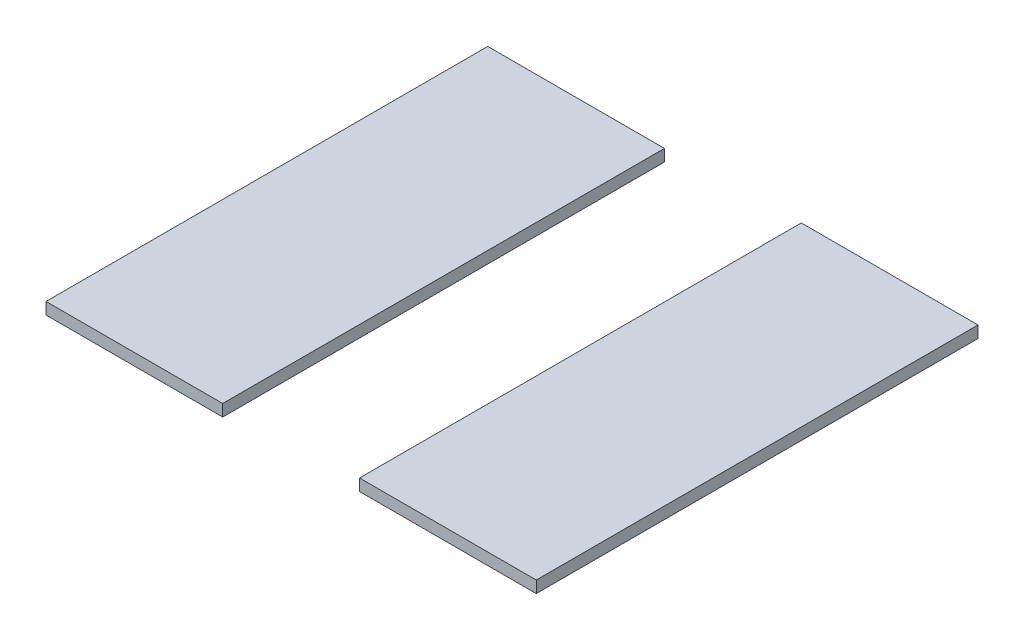
ISO-10303-21;
HEADER;
FILE_DESCRIPTION(('STEP AP214'),'2;1');
FILE_NAME('part.step','',(''),(''),'','','');
FILE_SCHEMA(('AUTOMOTIVE_DESIGN { 1 0 10303 214 1 1 1 1 }'));
ENDSEC;
DATA;
#1=APPLICATION_CONTEXT('core data for automotive mechanical design processes');
#2=APPLICATION_PROTOCOL_DEFINITION('international standard','automotive_design',2000,#1);
#3=PRODUCT_CONTEXT('',#1,'mechanical');
#4=PRODUCT('Part','Part','',(#3));
#5=PRODUCT_RELATED_PRODUCT_CATEGORY('part','',(#4));
#6=PRODUCT_DEFINITION_FORMATION('','',#4);
#7=PRODUCT_DEFINITION_CONTEXT('part definition',#1,'design');
#8=PRODUCT_DEFINITION('design','',#6,#7);
#9=PRODUCT_DEFINITION_SHAPE('','',#8);
#10=(LENGTH_UNIT() NAMED_UNIT(*) SI_UNIT(.MILLI.,.METRE.));
#11=(NAMED_UNIT(*) PLANE_ANGLE_UNIT() SI_UNIT($,.RADIAN.));
#12=(NAMED_UNIT(*) SI_UNIT($,.STERADIAN.) SOLID_ANGLE_UNIT());
#13=UNCERTAINTY_MEASURE_WITH_UNIT(LENGTH_MEASURE(1.E-05),#10,'distance_accuracy_value','');
#14=(GEOMETRIC_REPRESENTATION_CONTEXT(3) GLOBAL_UNCERTAINTY_ASSIGNED_CONTEXT((#13)) GLOBAL_UNIT_ASSIGNED_CONTEXT((#10,
#11,#12)) REPRESENTATION_CONTEXT('',''));
#15=CARTESIAN_POINT('',(0.,0.,0.));
#16=DIRECTION('',(0.,0.,1.));
#17=DIRECTION('',(1.,0.,0.));
#18=AXIS2_PLACEMENT_3D('',#15,#16,#17);
#19=CARTESIAN_POINT('',(-216.791531356344,0.,-95.4883179387457));
#20=DIRECTION('',(1.,0.,0.));
#21=DIRECTION('',(0.,0.,-1.));
#22=AXIS2_PLACEMENT_3D('',#19,#20,#21);
#23=PLANE('',#22);
#24=DIRECTION('',(0.,1.,0.));
#25=VECTOR('',#24,1.);
#26=CARTESIAN_POINT('',(-216.791531356344,0.,95.0116820612543));
#27=LINE('',#26,#25);
#28=CARTESIAN_POINT('',(-216.791531356344,0.,95.0116820612543));
#29=VERTEX_POINT('',#28);
#30=CARTESIAN_POINT('',(-216.791531356344,5.08,95.0116820612543));
#31=VERTEX_POINT('',#30);
#32=EDGE_CURVE('E12',#29,#31,#27,.T.);
#33=ORIENTED_EDGE('',*,*,#32,.F.);
#34=DIRECTION('',(0.,0.,-1.));
#35=VECTOR('',#34,1.);
#36=CARTESIAN_POINT('',(-216.791531356344,0.,-95.4883179387457));
#37=LINE('',#36,#35);
#38=CARTESIAN_POINT('',(-216.791531356344,0.,-95.4883179387457));
#39=VERTEX_POINT('',#38);
#40=EDGE_CURVE('E102',#29,#39,#37,.T.);
#41=ORIENTED_EDGE('',*,*,#40,.T.);
#42=DIRECTION('',(0.,1.,0.));
#43=VECTOR('',#42,1.);
#44=CARTESIAN_POINT('',(-216.791531356344,0.,-95.4883179387457));
#45=LINE('',#44,#43);
#46=CARTESIAN_POINT('',(-216.791531356344,5.08,-95.4883179387457));
#47=VERTEX_POINT('',#46);
#48=EDGE_CURVE('E57',#39,#47,#45,.T.);
#49=ORIENTED_EDGE('',*,*,#48,.T.);
#50=DIRECTION('',(0.,0.,1.));
#51=VECTOR('',#50,1.);
#52=CARTESIAN_POINT('',(-216.791531356344,5.08,0.));
#53=LINE('',#52,#51);
#54=EDGE_CURVE('E112',#31,#47,#53,.F.);
#55=ORIENTED_EDGE('',*,*,#54,.F.);
#56=EDGE_LOOP('',(#33,#41,#49,#55));
#57=FACE_BOUND('',#56,.T.);
#58=ADVANCED_FACE('F47',(#57),#23,.T.);
#59=CARTESIAN_POINT('',(-292.991531356344,0.,-95.4883179387457));
#60=DIRECTION('',(0.,0.,-1.));
#61=DIRECTION('',(-1.,0.,0.));
#62=AXIS2_PLACEMENT_3D('',#59,#60,#61);
#63=PLANE('',#62);
#64=ORIENTED_EDGE('',*,*,#48,.F.);
#65=DIRECTION('',(-1.,0.,0.));
#66=VECTOR('',#65,1.);
#67=CARTESIAN_POINT('',(-292.991531356344,0.,-95.4883179387457));
#68=LINE('',#67,#66);
#69=CARTESIAN_POINT('',(-292.991531356344,0.,-95.4883179387457));
#70=VERTEX_POINT('',#69);
#71=EDGE_CURVE('E97',#39,#70,#68,.T.);
#72=ORIENTED_EDGE('',*,*,#71,.T.);
#73=DIRECTION('',(0.,1.,0.));
#74=VECTOR('',#73,1.);
#75=CARTESIAN_POINT('',(-292.991531356344,0.,-95.4883179387457));
#76=LINE('',#75,#74);
#77=CARTESIAN_POINT('',(-292.991531356344,5.08,-95.4883179387457));
#78=VERTEX_POINT('',#77);
#79=EDGE_CURVE('E65',#70,#78,#76,.T.);
#80=ORIENTED_EDGE('',*,*,#79,.T.);
#81=DIRECTION('',(1.,0.,0.));
#82=VECTOR('',#81,1.);
#83=CARTESIAN_POINT('',(0.,5.08,-95.4883179387457));
#84=LINE('',#83,#82);
#85=EDGE_CURVE('E116',#47,#78,#84,.F.);
#86=ORIENTED_EDGE('',*,*,#85,.F.);
#87=EDGE_LOOP('',(#64,#72,#80,#86));
#88=FACE_BOUND('',#87,.T.);
#89=ADVANCED_FACE('F101',(#88),#63,.T.);
#90=CARTESIAN_POINT('',(-292.991531356344,0.,-95.4883179387457));
#91=DIRECTION('',(-1.,0.,0.));
#92=DIRECTION('',(0.,0.,1.));
#93=AXIS2_PLACEMENT_3D('',#90,#91,#92);
#94=PLANE('',#93);
#95=ORIENTED_EDGE('',*,*,#79,.F.);
#96=DIRECTION('',(0.,0.,1.));
#97=VECTOR('',#96,1.);
#98=CARTESIAN_POINT('',(-292.991531356344,0.,-95.4883179387457));
#99=LINE('',#98,#97);
#100=CARTESIAN_POINT('',(-292.991531356344,0.,95.0116820612543));
#101=VERTEX_POINT('',#100);
#102=EDGE_CURVE('E87',#70,#101,#99,.T.);
#103=ORIENTED_EDGE('',*,*,#102,.T.);
#104=DIRECTION('',(0.,1.,0.));
#105=VECTOR('',#104,1.);
#106=CARTESIAN_POINT('',(-292.991531356344,0.,95.0116820612543));
#107=LINE('',#106,#105);
#108=CARTESIAN_POINT('',(-292.991531356344,5.08,95.0116820612543));
#109=VERTEX_POINT('',#108);
#110=EDGE_CURVE('E51',#101,#109,#107,.T.);
#111=ORIENTED_EDGE('',*,*,#110,.T.);
#112=DIRECTION('',(0.,0.,1.));
#113=VECTOR('',#112,1.);
#114=CARTESIAN_POINT('',(-292.991531356344,5.08,0.));
#115=LINE('',#114,#113);
#116=EDGE_CURVE('E89',#78,#109,#115,.T.);
#117=ORIENTED_EDGE('',*,*,#116,.F.);
#118=EDGE_LOOP('',(#95,#103,#111,#117));
#119=FACE_BOUND('',#118,.T.);
#120=ADVANCED_FACE('F86',(#119),#94,.T.);
#121=CARTESIAN_POINT('',(-292.991531356344,0.,95.0116820612543));
#122=DIRECTION('',(0.,0.,1.));
#123=DIRECTION('',(1.,0.,0.));
#124=AXIS2_PLACEMENT_3D('',#121,#122,#123);
#125=PLANE('',#124);
#126=DIRECTION('',(1.,0.,0.));
#127=VECTOR('',#126,1.);
#128=CARTESIAN_POINT('',(-292.991531356344,0.,95.0116820612543));
#129=LINE('',#128,#127);
#130=EDGE_CURVE('E99',#101,#29,#129,.T.);
#131=ORIENTED_EDGE('',*,*,#130,.T.);
#132=ORIENTED_EDGE('',*,*,#32,.T.);
#133=DIRECTION('',(1.,0.,0.));
#134=VECTOR('',#133,1.);
#135=CARTESIAN_POINT('',(0.,5.08,95.0116820612543));
#136=LINE('',#135,#134);
#137=EDGE_CURVE('E104',#109,#31,#136,.T.);
#138=ORIENTED_EDGE('',*,*,#137,.F.);
#139=ORIENTED_EDGE('',*,*,#110,.F.);
#140=EDGE_LOOP('',(#131,#132,#138,#139));
#141=FACE_BOUND('',#140,.T.);
#142=ADVANCED_FACE('F49',(#141),#125,.T.);
#143=CARTESIAN_POINT('',(0.,5.08,0.));
#144=DIRECTION('',(0.,1.,0.));
#145=DIRECTION('',(0.,0.,1.));
#146=AXIS2_PLACEMENT_3D('',#143,#144,#145);
#147=PLANE('',#146);
#148=ORIENTED_EDGE('',*,*,#116,.T.);
#149=ORIENTED_EDGE('',*,*,#137,.T.);
#150=ORIENTED_EDGE('',*,*,#54,.T.);
#151=ORIENTED_EDGE('',*,*,#85,.T.);
#152=EDGE_LOOP('',(#148,#149,#150,#151));
#153=FACE_BOUND('',#152,.T.);
#154=ADVANCED_FACE('F115',(#153),#147,.T.);
#155=CARTESIAN_POINT('',(0.,0.,0.));
#156=DIRECTION('',(0.,1.,0.));
#157=DIRECTION('',(0.,0.,1.));
#158=AXIS2_PLACEMENT_3D('',#155,#156,#157);
#159=PLANE('',#158);
#160=ORIENTED_EDGE('',*,*,#102,.F.);
#161=ORIENTED_EDGE('',*,*,#71,.F.);
#162=ORIENTED_EDGE('',*,*,#40,.F.);
#163=ORIENTED_EDGE('',*,*,#130,.F.);
#164=EDGE_LOOP('',(#160,#161,#162,#163));
#165=FACE_BOUND('',#164,.T.);
#166=ADVANCED_FACE('F95',(#165),#159,.F.);
#167=CLOSED_SHELL('',(#58,#89,#120,#142,#154,#166));
#168=MANIFOLD_SOLID_BREP('B2',#167);
#169=CARTESIAN_POINT('',(-83.2532231404959,0.,-97.1707438016529));
#170=DIRECTION('',(1.,0.,0.));
#171=DIRECTION('',(0.,0.,-1.));
#172=AXIS2_PLACEMENT_3D('',#169,#170,#171);
#173=PLANE('',#172);
#174=DIRECTION('',(0.,1.,0.));
#175=VECTOR('',#174,1.);
#176=CARTESIAN_POINT('',(-83.2532231404959,0.,93.3292561983471));
#177=LINE('',#176,#175);
#178=CARTESIAN_POINT('',(-83.2532231404959,0.,93.3292561983471));
#179=VERTEX_POINT('',#178);
#180=CARTESIAN_POINT('',(-83.2532231404959,5.08,93.3292561983471));
#181=VERTEX_POINT('',#180);
#182=EDGE_CURVE('E45',#179,#181,#177,.T.);
#183=ORIENTED_EDGE('',*,*,#182,.F.);
#184=DIRECTION('',(0.,0.,-1.));
#185=VECTOR('',#184,1.);
#186=CARTESIAN_POINT('',(-83.2532231404959,0.,-97.1707438016529));
#187=LINE('',#186,#185);
#188=CARTESIAN_POINT('',(-83.2532231404959,0.,-97.1707438016529));
#189=VERTEX_POINT('',#188);
#190=EDGE_CURVE('E226',#179,#189,#187,.T.);
#191=ORIENTED_EDGE('',*,*,#190,.T.);
#192=DIRECTION('',(0.,1.,0.));
#193=VECTOR('',#192,1.);
#194=CARTESIAN_POINT('',(-83.2532231404959,0.,-97.1707438016529));
#195=LINE('',#194,#193);
#196=CARTESIAN_POINT('',(-83.2532231404959,5.08,-97.1707438016529));
#197=VERTEX_POINT('',#196);
#198=EDGE_CURVE('E181',#189,#197,#195,.T.);
#199=ORIENTED_EDGE('',*,*,#198,.T.);
#200=DIRECTION('',(0.,0.,1.));
#201=VECTOR('',#200,1.);
#202=CARTESIAN_POINT('',(-83.2532231404959,5.08,0.));
#203=LINE('',#202,#201);
#204=EDGE_CURVE('E236',#181,#197,#203,.F.);
#205=ORIENTED_EDGE('',*,*,#204,.F.);
#206=EDGE_LOOP('',(#183,#191,#199,#205));
#207=FACE_BOUND('',#206,.T.);
#208=ADVANCED_FACE('F171',(#207),#173,.T.);
#209=CARTESIAN_POINT('',(-159.453223140496,0.,-97.1707438016529));
#210=DIRECTION('',(0.,0.,-1.));
#211=DIRECTION('',(-1.,0.,0.));
#212=AXIS2_PLACEMENT_3D('',#209,#210,#211);
#213=PLANE('',#212);
#214=ORIENTED_EDGE('',*,*,#198,.F.);
#215=DIRECTION('',(-1.,0.,0.));
#216=VECTOR('',#215,1.);
#217=CARTESIAN_POINT('',(-159.453223140496,0.,-97.1707438016529));
#218=LINE('',#217,#216);
#219=CARTESIAN_POINT('',(-159.453223140496,0.,-97.1707438016529));
#220=VERTEX_POINT('',#219);
#221=EDGE_CURVE('E221',#189,#220,#218,.T.);
#222=ORIENTED_EDGE('',*,*,#221,.T.);
#223=DIRECTION('',(0.,1.,0.));
#224=VECTOR('',#223,1.);
#225=CARTESIAN_POINT('',(-159.453223140496,0.,-97.1707438016529));
#226=LINE('',#225,#224);
#227=CARTESIAN_POINT('',(-159.453223140496,5.08,-97.1707438016529));
#228=VERTEX_POINT('',#227);
#229=EDGE_CURVE('E189',#220,#228,#226,.T.);
#230=ORIENTED_EDGE('',*,*,#229,.T.);
#231=DIRECTION('',(1.,0.,0.));
#232=VECTOR('',#231,1.);
#233=CARTESIAN_POINT('',(0.,5.08,-97.1707438016529));
#234=LINE('',#233,#232);
#235=EDGE_CURVE('E240',#197,#228,#234,.F.);
#236=ORIENTED_EDGE('',*,*,#235,.F.);
#237=EDGE_LOOP('',(#214,#222,#230,#236));
#238=FACE_BOUND('',#237,.T.);
#239=ADVANCED_FACE('F225',(#238),#213,.T.);
#240=CARTESIAN_POINT('',(-159.453223140496,0.,-97.1707438016529));
#241=DIRECTION('',(-1.,0.,0.));
#242=DIRECTION('',(0.,0.,1.));
#243=AXIS2_PLACEMENT_3D('',#240,#241,#242);
#244=PLANE('',#243);
#245=ORIENTED_EDGE('',*,*,#229,.F.);
#246=DIRECTION('',(0.,0.,1.));
#247=VECTOR('',#246,1.);
#248=CARTESIAN_POINT('',(-159.453223140496,0.,-97.1707438016529));
#249=LINE('',#248,#247);
#250=CARTESIAN_POINT('',(-159.453223140496,0.,93.3292561983471));
#251=VERTEX_POINT('',#250);
#252=EDGE_CURVE('E211',#220,#251,#249,.T.);
#253=ORIENTED_EDGE('',*,*,#252,.T.);
#254=DIRECTION('',(0.,1.,0.));
#255=VECTOR('',#254,1.);
#256=CARTESIAN_POINT('',(-159.453223140496,0.,93.3292561983471));
#257=LINE('',#256,#255);
#258=CARTESIAN_POINT('',(-159.453223140496,5.08,93.3292561983471));
#259=VERTEX_POINT('',#258);
#260=EDGE_CURVE('E175',#251,#259,#257,.T.);
#261=ORIENTED_EDGE('',*,*,#260,.T.);
#262=DIRECTION('',(0.,0.,1.));
#263=VECTOR('',#262,1.);
#264=CARTESIAN_POINT('',(-159.453223140496,5.08,0.));
#265=LINE('',#264,#263);
#266=EDGE_CURVE('E213',#228,#259,#265,.T.);
#267=ORIENTED_EDGE('',*,*,#266,.F.);
#268=EDGE_LOOP('',(#245,#253,#261,#267));
#269=FACE_BOUND('',#268,.T.);
#270=ADVANCED_FACE('F210',(#269),#244,.T.);
#271=CARTESIAN_POINT('',(-159.453223140496,0.,93.3292561983471));
#272=DIRECTION('',(0.,0.,1.));
#273=DIRECTION('',(1.,0.,0.));
#274=AXIS2_PLACEMENT_3D('',#271,#272,#273);
#275=PLANE('',#274);
#276=DIRECTION('',(1.,0.,0.));
#277=VECTOR('',#276,1.);
#278=CARTESIAN_POINT('',(-159.453223140496,0.,93.3292561983471));
#279=LINE('',#278,#277);
#280=EDGE_CURVE('E223',#251,#179,#279,.T.);
#281=ORIENTED_EDGE('',*,*,#280,.T.);
#282=ORIENTED_EDGE('',*,*,#182,.T.);
#283=DIRECTION('',(1.,0.,0.));
#284=VECTOR('',#283,1.);
#285=CARTESIAN_POINT('',(0.,5.08,93.3292561983471));
#286=LINE('',#285,#284);
#287=EDGE_CURVE('E228',#259,#181,#286,.T.);
#288=ORIENTED_EDGE('',*,*,#287,.F.);
#289=ORIENTED_EDGE('',*,*,#260,.F.);
#290=EDGE_LOOP('',(#281,#282,#288,#289));
#291=FACE_BOUND('',#290,.T.);
#292=ADVANCED_FACE('F173',(#291),#275,.T.);
#293=CARTESIAN_POINT('',(0.,5.08,0.));
#294=DIRECTION('',(0.,1.,0.));
#295=DIRECTION('',(0.,0.,1.));
#296=AXIS2_PLACEMENT_3D('',#293,#294,#295);
#297=PLANE('',#296);
#298=ORIENTED_EDGE('',*,*,#266,.T.);
#299=ORIENTED_EDGE('',*,*,#287,.T.);
#300=ORIENTED_EDGE('',*,*,#204,.T.);
#301=ORIENTED_EDGE('',*,*,#235,.T.);
#302=EDGE_LOOP('',(#298,#299,#300,#301));
#303=FACE_BOUND('',#302,.T.);
#304=ADVANCED_FACE('F239',(#303),#297,.T.);
#305=CARTESIAN_POINT('',(0.,0.,0.));
#306=DIRECTION('',(0.,1.,0.));
#307=DIRECTION('',(0.,0.,1.));
#308=AXIS2_PLACEMENT_3D('',#305,#306,#307);
#309=PLANE('',#308);
#310=ORIENTED_EDGE('',*,*,#252,.F.);
#311=ORIENTED_EDGE('',*,*,#221,.F.);
#312=ORIENTED_EDGE('',*,*,#190,.F.);
#313=ORIENTED_EDGE('',*,*,#280,.F.);
#314=EDGE_LOOP('',(#310,#311,#312,#313));
#315=FACE_BOUND('',#314,.T.);
#316=ADVANCED_FACE('F219',(#315),#309,.F.);
#317=CLOSED_SHELL('',(#208,#239,#270,#292,#304,#316));
#318=MANIFOLD_SOLID_BREP('B6',#317);
#319=ADVANCED_BREP_SHAPE_REPRESENTATION('',(#18,#168,#318),#14);
#320=SHAPE_DEFINITION_REPRESENTATION(#9,#319);
ENDSEC;
END-ISO-10303-21;
